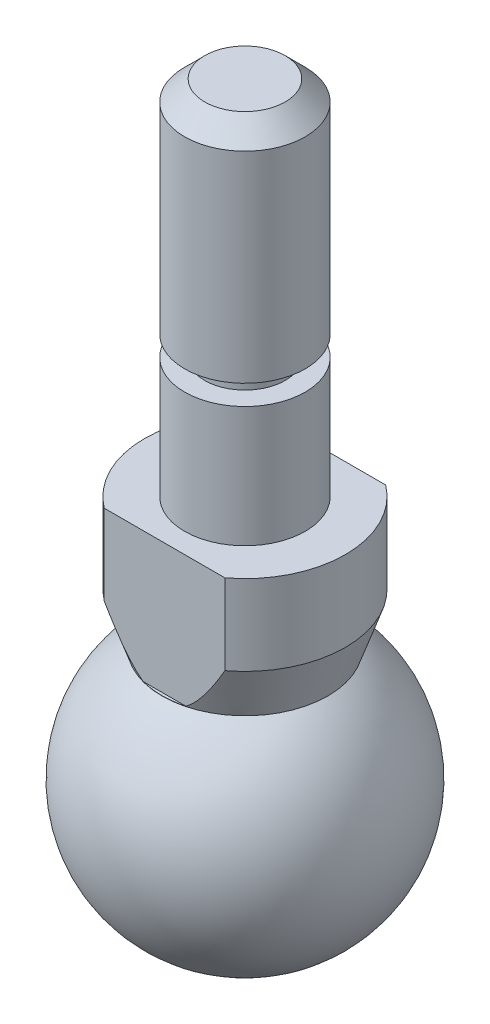
ISO-10303-21;
HEADER;
FILE_DESCRIPTION(('STEP AP214'),'2;1');
FILE_NAME('part.step','',(''),(''),'','','');
FILE_SCHEMA(('AUTOMOTIVE_DESIGN { 1 0 10303 214 1 1 1 1 }'));
ENDSEC;
DATA;
#1=APPLICATION_CONTEXT('core data for automotive mechanical design processes');
#2=APPLICATION_PROTOCOL_DEFINITION('international standard','automotive_design',2000,#1);
#3=PRODUCT_CONTEXT('',#1,'mechanical');
#4=PRODUCT('Part','Part','',(#3));
#5=PRODUCT_RELATED_PRODUCT_CATEGORY('part','',(#4));
#6=PRODUCT_DEFINITION_FORMATION('','',#4);
#7=PRODUCT_DEFINITION_CONTEXT('part definition',#1,'design');
#8=PRODUCT_DEFINITION('design','',#6,#7);
#9=PRODUCT_DEFINITION_SHAPE('','',#8);
#10=(LENGTH_UNIT() NAMED_UNIT(*) SI_UNIT(.MILLI.,.METRE.));
#11=(NAMED_UNIT(*) PLANE_ANGLE_UNIT() SI_UNIT($,.RADIAN.));
#12=(NAMED_UNIT(*) SI_UNIT($,.STERADIAN.) SOLID_ANGLE_UNIT());
#13=UNCERTAINTY_MEASURE_WITH_UNIT(LENGTH_MEASURE(1.E-05),#10,'distance_accuracy_value','');
#14=(GEOMETRIC_REPRESENTATION_CONTEXT(3) GLOBAL_UNCERTAINTY_ASSIGNED_CONTEXT((#13)) GLOBAL_UNIT_ASSIGNED_CONTEXT((#10,
#11,#12)) REPRESENTATION_CONTEXT('',''));
#15=CARTESIAN_POINT('',(0.,0.,0.));
#16=DIRECTION('',(0.,0.,1.));
#17=DIRECTION('',(1.,0.,0.));
#18=AXIS2_PLACEMENT_3D('',#15,#16,#17);
#19=CARTESIAN_POINT('',(0.,30.175,0.));
#20=DIRECTION('',(0.,1.,0.));
#21=DIRECTION('',(0.,0.,1.));
#22=AXIS2_PLACEMENT_3D('',#19,#20,#21);
#23=CYLINDRICAL_SURFACE('',#22,5.);
#24=CARTESIAN_POINT('',(0.,8.175,0.));
#25=DIRECTION('',(0.,1.,0.));
#26=DIRECTION('',(0.,0.,1.));
#27=AXIS2_PLACEMENT_3D('',#24,#25,#26);
#28=CIRCLE('',#27,5.);
#29=CARTESIAN_POINT('',(3.,8.175,4.));
#30=VERTEX_POINT('',#29);
#31=CARTESIAN_POINT('',(3.,8.175,-4.));
#32=VERTEX_POINT('',#31);
#33=EDGE_CURVE('E122',#30,#32,#28,.T.);
#34=ORIENTED_EDGE('',*,*,#33,.T.);
#35=DIRECTION('',(0.,1.,0.));
#36=VECTOR('',#35,1.);
#37=CARTESIAN_POINT('',(3.,30.175,-4.));
#38=LINE('',#37,#36);
#39=CARTESIAN_POINT('',(3.,12.175,-4.));
#40=VERTEX_POINT('',#39);
#41=EDGE_CURVE('E157',#32,#40,#38,.T.);
#42=ORIENTED_EDGE('',*,*,#41,.T.);
#43=CARTESIAN_POINT('',(0.,12.175,0.));
#44=DIRECTION('',(0.,1.,0.));
#45=DIRECTION('',(0.,0.,1.));
#46=AXIS2_PLACEMENT_3D('',#43,#44,#45);
#47=CIRCLE('',#46,5.);
#48=CARTESIAN_POINT('',(3.,12.175,4.));
#49=VERTEX_POINT('',#48);
#50=EDGE_CURVE('E114',#49,#40,#47,.T.);
#51=ORIENTED_EDGE('',*,*,#50,.F.);
#52=DIRECTION('',(0.,1.,0.));
#53=VECTOR('',#52,1.);
#54=CARTESIAN_POINT('',(3.,30.175,4.));
#55=LINE('',#54,#53);
#56=EDGE_CURVE('E64',#49,#30,#55,.F.);
#57=ORIENTED_EDGE('',*,*,#56,.T.);
#58=EDGE_LOOP('',(#34,#42,#51,#57));
#59=FACE_BOUND('',#58,.T.);
#60=ADVANCED_FACE('F40',(#59),#23,.T.);
#61=CARTESIAN_POINT('',(0.,0.,0.));
#62=DIRECTION('',(0.,1.,0.));
#63=DIRECTION('',(1.,0.,0.));
#64=AXIS2_PLACEMENT_3D('',#61,#62,#63);
#65=SPHERICAL_SURFACE('',#64,7.);
#66=CARTESIAN_POINT('',(0.,5.65055793975272,0.));
#67=DIRECTION('',(0.,1.,0.));
#68=DIRECTION('',(0.,0.,1.));
#69=AXIS2_PLACEMENT_3D('',#66,#67,#68);
#70=CIRCLE('',#69,4.13173026340024);
#71=CARTESIAN_POINT('',(0.,5.65055793975272,4.13173026340024));
#72=VERTEX_POINT('',#71);
#73=EDGE_CURVE('E125',#72,#72,#70,.T.);
#74=ORIENTED_EDGE('',*,*,#73,.F.);
#75=EDGE_LOOP('',(#74));
#76=FACE_BOUND('',#75,.T.);
#77=ADVANCED_FACE('F209',(#76),#65,.T.);
#78=CARTESIAN_POINT('',(0.,5.65055793975272,0.));
#79=DIRECTION('',(0.,1.,0.));
#80=DIRECTION('',(0.,0.,1.));
#81=AXIS2_PLACEMENT_3D('',#78,#79,#80);
#82=CONICAL_SURFACE('',#81,4.13173026340024,0.331270640690504);
#83=CARTESIAN_POINT('',(-3.,8.175,-4.));
#84=VERTEX_POINT('',#83);
#85=CARTESIAN_POINT('',(-3.,8.175,4.));
#86=VERTEX_POINT('',#85);
#87=EDGE_CURVE('E109',#84,#86,#28,.T.);
#88=ORIENTED_EDGE('',*,*,#87,.F.);
#89=CARTESIAN_POINT('',(-3.00040125223051,8.1757,-4.));
#90=CARTESIAN_POINT('',(-2.92709025614013,8.04787734366509,-4.));
#91=CARTESIAN_POINT('',(-2.85253885244667,7.9207420998407,-4.));
#92=CARTESIAN_POINT('',(-2.70025129608866,7.668230321007,-4.));
#93=CARTESIAN_POINT('',(-2.62251214400752,7.54285559861608,-4.));
#94=CARTESIAN_POINT('',(-2.46156321835939,7.29181300916988,-4.));
#95=CARTESIAN_POINT('',(-2.37827151976003,7.16619737684099,-4.));
#96=CARTESIAN_POINT('',(-2.2068510719268,6.91835645552338,-4.));
#97=CARTESIAN_POINT('',(-2.11872432522357,6.79612979403244,-4.));
#98=CARTESIAN_POINT('',(-1.9590094929458,6.58619254266003,-4.));
#99=CARTESIAN_POINT('',(-1.88876510038713,6.49746357705535,-4.));
#100=CARTESIAN_POINT('',(-1.74406991104235,6.32351563826822,-4.));
#101=CARTESIAN_POINT('',(-1.66962027976843,6.23829570374424,-4.));
#102=CARTESIAN_POINT('',(-1.51603715612773,6.07311703678136,-4.));
#103=CARTESIAN_POINT('',(-1.43693535013711,5.99312912247618,-4.));
#104=CARTESIAN_POINT('',(-1.27256841860136,5.83982713674373,-4.));
#105=CARTESIAN_POINT('',(-1.187310221692,5.7665057662656,-4.));
#106=CARTESIAN_POINT('',(-1.02025852419477,5.63791180950292,-4.));
#107=CARTESIAN_POINT('',(-0.939333550166531,5.58152850408279,-4.));
#108=CARTESIAN_POINT('',(-0.770953835498196,5.47918477131679,-4.));
#109=CARTESIAN_POINT('',(-0.683497266349091,5.43322727730737,-4.));
#110=CARTESIAN_POINT('',(-0.500707043210453,5.3553381307687,-4.));
#111=CARTESIAN_POINT('',(-0.405272268012618,5.32363503324268,-4.));
#112=CARTESIAN_POINT('',(-0.210007543253151,5.28017539123589,-4.));
#113=CARTESIAN_POINT('',(-0.110190576816242,5.26836353206917,-4.));
#114=CARTESIAN_POINT('',(0.0753490696354366,5.26694285655749,-4.));
#115=CARTESIAN_POINT('',(0.161058475495222,5.27441680191744,-4.));
#116=CARTESIAN_POINT('',(0.329799239823299,5.30444494053993,-4.));
#117=CARTESIAN_POINT('',(0.412827194907424,5.32701756542325,-4.));
#118=CARTESIAN_POINT('',(0.601583831716989,5.3942133416849,-4.));
#119=CARTESIAN_POINT('',(0.705543083091387,5.44370194674514,-4.));
#120=CARTESIAN_POINT('',(0.904712053223092,5.55791292800328,-4.));
#121=CARTESIAN_POINT('',(0.999894839083723,5.62268015944739,-4.));
#122=CARTESIAN_POINT('',(1.2051025877491,5.77968455989777,-4.));
#123=CARTESIAN_POINT('',(1.31292549048604,5.87474664823965,-4.));
#124=CARTESIAN_POINT('',(1.5190862524775,6.07477599780695,-4.));
#125=CARTESIAN_POINT('',(1.61740452074314,6.17976287118333,-4.));
#126=CARTESIAN_POINT('',(1.80723746246576,6.3969428959373,-4.));
#127=CARTESIAN_POINT('',(1.89869973865099,6.5091813149998,-4.));
#128=CARTESIAN_POINT('',(2.07564477785175,6.73807996428054,-4.));
#129=CARTESIAN_POINT('',(2.16113246607184,6.85473642713118,-4.));
#130=CARTESIAN_POINT('',(2.3129895663335,7.07078364417233,-4.));
#131=CARTESIAN_POINT('',(2.38010173061988,7.16965640301758,-4.));
#132=CARTESIAN_POINT('',(2.51165482579349,7.36918733156567,-4.));
#133=CARTESIAN_POINT('',(2.57609522111666,7.4698458535111,-4.));
#134=CARTESIAN_POINT('',(2.70157346413383,7.67076988586631,-4.));
#135=CARTESIAN_POINT('',(2.76265149340876,7.77101040247133,-4.));
#136=CARTESIAN_POINT('',(2.88288623231024,7.97258407650308,-4.));
#137=CARTESIAN_POINT('',(2.94204370177505,8.07391678015668,-4.));
#138=CARTESIAN_POINT('',(3.00040125223051,8.1757,-4.));
#139=B_SPLINE_CURVE_WITH_KNOTS('',3,(#89,#90,#91,#92,#93,#94,#95,#96,#97,#98,#99,#100,#101,#102,
#103,#104,#105,#106,#107,#108,#109,#110,#111,#112,#113,#114,#115,#116,#117,#118,#119,#120,#121,
#122,#123,#124,#125,#126,#127,#128,#129,#130,#131,#132,#133,#134,#135,#136,#137,#138),
.UNSPECIFIED.,.F.,.F.,(4,2,2,2,2,2,2,2,2,2,2,2,2,2,2,2,2,2,2,2,2,2,2,2,4),(0.,0.442085903443447,
0.884597774016387,1.33667410250264,1.78856458770313,2.12796949270043,2.46728078640878,
2.80450139212958,3.14134822083874,3.43667041843167,3.73207560313377,4.03206173194214,
4.33121225626096,4.58784244594604,4.84478648850201,5.18824470397727,5.53272408190323,
5.96294002745509,6.39402462934943,6.82812442615062,7.26186204159843,7.62030931775516,
7.97882810173971,8.33095438808143,8.68293962026138),.UNSPECIFIED.);
#140=CARTESIAN_POINT('',(-1.06805164618176,5.675,-4.));
#141=VERTEX_POINT('',#140);
#142=EDGE_CURVE('E154',#84,#141,#139,.T.);
#143=ORIENTED_EDGE('',*,*,#142,.T.);
#144=CARTESIAN_POINT('',(0.,5.675,0.));
#145=DIRECTION('',(0.,1.,0.));
#146=DIRECTION('',(0.,0.,1.));
#147=AXIS2_PLACEMENT_3D('',#144,#145,#146);
#148=CIRCLE('',#147,4.14013699277108);
#149=CARTESIAN_POINT('',(1.06805164618176,5.675,-4.));
#150=VERTEX_POINT('',#149);
#151=EDGE_CURVE('E11',#150,#141,#148,.T.);
#152=ORIENTED_EDGE('',*,*,#151,.F.);
#153=EDGE_CURVE('E159',#150,#32,#139,.T.);
#154=ORIENTED_EDGE('',*,*,#153,.T.);
#155=ORIENTED_EDGE('',*,*,#33,.F.);
#156=CARTESIAN_POINT('',(3.00040125223051,8.1757,4.));
#157=CARTESIAN_POINT('',(2.92709025614013,8.04787734366509,4.));
#158=CARTESIAN_POINT('',(2.85253885244667,7.9207420998407,4.));
#159=CARTESIAN_POINT('',(2.70025129608866,7.668230321007,4.));
#160=CARTESIAN_POINT('',(2.62251214400752,7.54285559861608,4.));
#161=CARTESIAN_POINT('',(2.46156321835939,7.29181300916988,4.));
#162=CARTESIAN_POINT('',(2.37827151976003,7.16619737684099,4.));
#163=CARTESIAN_POINT('',(2.2068510719268,6.91835645552338,4.));
#164=CARTESIAN_POINT('',(2.11872432522357,6.79612979403244,4.));
#165=CARTESIAN_POINT('',(1.9590094929458,6.58619254266003,4.));
#166=CARTESIAN_POINT('',(1.88876510038713,6.49746357705535,4.));
#167=CARTESIAN_POINT('',(1.74406991104235,6.32351563826822,4.));
#168=CARTESIAN_POINT('',(1.66962027976843,6.23829570374424,4.));
#169=CARTESIAN_POINT('',(1.51603715612773,6.07311703678136,4.));
#170=CARTESIAN_POINT('',(1.43693535013711,5.99312912247618,4.));
#171=CARTESIAN_POINT('',(1.27256841860136,5.83982713674373,4.));
#172=CARTESIAN_POINT('',(1.187310221692,5.7665057662656,4.));
#173=CARTESIAN_POINT('',(1.02025852419477,5.63791180950292,4.));
#174=CARTESIAN_POINT('',(0.939333550166531,5.58152850408279,4.));
#175=CARTESIAN_POINT('',(0.770953835498196,5.47918477131679,4.));
#176=CARTESIAN_POINT('',(0.683497266349091,5.43322727730737,4.));
#177=CARTESIAN_POINT('',(0.500707043210453,5.3553381307687,4.));
#178=CARTESIAN_POINT('',(0.405272268012618,5.32363503324268,4.));
#179=CARTESIAN_POINT('',(0.210007543253151,5.28017539123589,4.));
#180=CARTESIAN_POINT('',(0.110190576816242,5.26836353206917,4.));
#181=CARTESIAN_POINT('',(-0.0753490696354366,5.26694285655749,4.));
#182=CARTESIAN_POINT('',(-0.161058475495222,5.27441680191744,4.));
#183=CARTESIAN_POINT('',(-0.329799239823299,5.30444494053993,4.));
#184=CARTESIAN_POINT('',(-0.412827194907424,5.32701756542325,4.));
#185=CARTESIAN_POINT('',(-0.601583831716989,5.3942133416849,4.));
#186=CARTESIAN_POINT('',(-0.705543083091387,5.44370194674514,4.));
#187=CARTESIAN_POINT('',(-0.904712053223092,5.55791292800328,4.));
#188=CARTESIAN_POINT('',(-0.999894839083723,5.62268015944739,4.));
#189=CARTESIAN_POINT('',(-1.2051025877491,5.77968455989777,4.));
#190=CARTESIAN_POINT('',(-1.31292549048604,5.87474664823965,4.));
#191=CARTESIAN_POINT('',(-1.5190862524775,6.07477599780695,4.));
#192=CARTESIAN_POINT('',(-1.61740452074314,6.17976287118333,4.));
#193=CARTESIAN_POINT('',(-1.80723746246576,6.3969428959373,4.));
#194=CARTESIAN_POINT('',(-1.89869973865099,6.5091813149998,4.));
#195=CARTESIAN_POINT('',(-2.07564477785175,6.73807996428054,4.));
#196=CARTESIAN_POINT('',(-2.16113246607184,6.85473642713118,4.));
#197=CARTESIAN_POINT('',(-2.3129895663335,7.07078364417233,4.));
#198=CARTESIAN_POINT('',(-2.38010173061988,7.16965640301758,4.));
#199=CARTESIAN_POINT('',(-2.51165482579349,7.36918733156567,4.));
#200=CARTESIAN_POINT('',(-2.57609522111666,7.4698458535111,4.));
#201=CARTESIAN_POINT('',(-2.70157346413383,7.67076988586631,4.));
#202=CARTESIAN_POINT('',(-2.76265149340876,7.77101040247133,4.));
#203=CARTESIAN_POINT('',(-2.88288623231024,7.97258407650308,4.));
#204=CARTESIAN_POINT('',(-2.94204370177505,8.07391678015668,4.));
#205=CARTESIAN_POINT('',(-3.00040125223051,8.1757,4.));
#206=B_SPLINE_CURVE_WITH_KNOTS('',3,(#156,#157,#158,#159,#160,#161,#162,#163,#164,#165,#166,
#167,#168,#169,#170,#171,#172,#173,#174,#175,#176,#177,#178,#179,#180,#181,#182,#183,#184,#185,
#186,#187,#188,#189,#190,#191,#192,#193,#194,#195,#196,#197,#198,#199,#200,#201,#202,#203,#204,
#205),.UNSPECIFIED.,.F.,.F.,(4,2,2,2,2,2,2,2,2,2,2,2,2,2,2,2,2,2,2,2,2,2,2,2,4),(0.,
0.442085903443447,0.884597774016387,1.33667410250264,1.78856458770313,2.12796949270043,
2.46728078640878,2.80450139212958,3.14134822083874,3.43667041843167,3.73207560313377,
4.03206173194214,4.33121225626096,4.58784244594604,4.84478648850201,5.18824470397727,
5.53272408190323,5.96294002745509,6.39402462934943,6.82812442615062,7.26186204159843,
7.62030931775516,7.97882810173971,8.33095438808143,8.68293962026138),.UNSPECIFIED.);
#207=CARTESIAN_POINT('',(1.06805164618176,5.675,4.));
#208=VERTEX_POINT('',#207);
#209=EDGE_CURVE('E111',#30,#208,#206,.T.);
#210=ORIENTED_EDGE('',*,*,#209,.T.);
#211=CARTESIAN_POINT('',(0.,5.675,0.));
#212=DIRECTION('',(0.,1.,0.));
#213=DIRECTION('',(0.,0.,1.));
#214=AXIS2_PLACEMENT_3D('',#211,#212,#213);
#215=CIRCLE('',#214,4.14013699277108);
#216=CARTESIAN_POINT('',(-1.06805164618176,5.675,4.));
#217=VERTEX_POINT('',#216);
#218=EDGE_CURVE('E49',#217,#208,#215,.T.);
#219=ORIENTED_EDGE('',*,*,#218,.F.);
#220=EDGE_CURVE('E110',#217,#86,#206,.T.);
#221=ORIENTED_EDGE('',*,*,#220,.T.);
#222=EDGE_LOOP('',(#88,#143,#152,#154,#155,#210,#219,#221));
#223=FACE_BOUND('',#222,.T.);
#224=ORIENTED_EDGE('',*,*,#73,.T.);
#225=EDGE_LOOP('',(#224));
#226=FACE_BOUND('',#225,.T.);
#227=ADVANCED_FACE('F143',(#223,#226),#82,.T.);
#228=CARTESIAN_POINT('',(-3.,12.175,-4.));
#229=VERTEX_POINT('',#228);
#230=CARTESIAN_POINT('',(-3.,12.175,4.));
#231=VERTEX_POINT('',#230);
#232=EDGE_CURVE('E107',#229,#231,#47,.T.);
#233=ORIENTED_EDGE('',*,*,#232,.F.);
#234=DIRECTION('',(0.,1.,0.));
#235=VECTOR('',#234,1.);
#236=CARTESIAN_POINT('',(-3.,30.175,-4.));
#237=LINE('',#236,#235);
#238=EDGE_CURVE('E56',#229,#84,#237,.F.);
#239=ORIENTED_EDGE('',*,*,#238,.T.);
#240=ORIENTED_EDGE('',*,*,#87,.T.);
#241=DIRECTION('',(0.,1.,0.));
#242=VECTOR('',#241,1.);
#243=CARTESIAN_POINT('',(-3.,30.175,4.));
#244=LINE('',#243,#242);
#245=EDGE_CURVE('E94',#86,#231,#244,.T.);
#246=ORIENTED_EDGE('',*,*,#245,.T.);
#247=EDGE_LOOP('',(#233,#239,#240,#246));
#248=FACE_BOUND('',#247,.T.);
#249=ADVANCED_FACE('F106',(#248),#23,.T.);
#250=CARTESIAN_POINT('',(5.,12.175,0.));
#251=DIRECTION('',(0.,-1.,0.));
#252=DIRECTION('',(0.,0.,-1.));
#253=AXIS2_PLACEMENT_3D('',#250,#251,#252);
#254=PLANE('',#253);
#255=CARTESIAN_POINT('',(0.,12.175,0.));
#256=DIRECTION('',(0.,1.,0.));
#257=DIRECTION('',(0.,0.,1.));
#258=AXIS2_PLACEMENT_3D('',#255,#256,#257);
#259=CIRCLE('',#258,3.);
#260=CARTESIAN_POINT('',(0.,12.175,3.));
#261=VERTEX_POINT('',#260);
#262=EDGE_CURVE('E115',#261,#261,#259,.T.);
#263=ORIENTED_EDGE('',*,*,#262,.F.);
#264=EDGE_LOOP('',(#263));
#265=FACE_BOUND('',#264,.T.);
#266=ORIENTED_EDGE('',*,*,#50,.T.);
#267=DIRECTION('',(-1.,0.,0.));
#268=VECTOR('',#267,1.);
#269=CARTESIAN_POINT('',(5.,12.175,-4.));
#270=LINE('',#269,#268);
#271=EDGE_CURVE('E100',#40,#229,#270,.T.);
#272=ORIENTED_EDGE('',*,*,#271,.T.);
#273=ORIENTED_EDGE('',*,*,#232,.T.);
#274=DIRECTION('',(1.,0.,0.));
#275=VECTOR('',#274,1.);
#276=CARTESIAN_POINT('',(5.,12.175,4.));
#277=LINE('',#276,#275);
#278=EDGE_CURVE('E90',#231,#49,#277,.T.);
#279=ORIENTED_EDGE('',*,*,#278,.T.);
#280=EDGE_LOOP('',(#266,#272,#273,#279));
#281=FACE_BOUND('',#280,.T.);
#282=ADVANCED_FACE('F113',(#265,#281),#254,.F.);
#283=CARTESIAN_POINT('',(0.,30.175,0.));
#284=DIRECTION('',(0.,1.,0.));
#285=DIRECTION('',(0.,0.,1.));
#286=AXIS2_PLACEMENT_3D('',#283,#284,#285);
#287=CYLINDRICAL_SURFACE('',#286,3.);
#288=CARTESIAN_POINT('',(0.,18.175,0.));
#289=DIRECTION('',(0.,1.,0.));
#290=DIRECTION('',(0.,0.,1.));
#291=AXIS2_PLACEMENT_3D('',#288,#289,#290);
#292=CIRCLE('',#291,3.);
#293=CARTESIAN_POINT('',(0.,18.175,3.));
#294=VERTEX_POINT('',#293);
#295=EDGE_CURVE('E118',#294,#294,#292,.T.);
#296=ORIENTED_EDGE('',*,*,#295,.F.);
#297=EDGE_LOOP('',(#296));
#298=FACE_BOUND('',#297,.T.);
#299=ORIENTED_EDGE('',*,*,#262,.T.);
#300=EDGE_LOOP('',(#299));
#301=FACE_BOUND('',#300,.T.);
#302=ADVANCED_FACE('F198',(#298,#301),#287,.T.);
#303=CARTESIAN_POINT('',(3.,18.175,0.));
#304=DIRECTION('',(0.,-1.,0.));
#305=DIRECTION('',(0.,0.,-1.));
#306=AXIS2_PLACEMENT_3D('',#303,#304,#305);
#307=PLANE('',#306);
#308=CARTESIAN_POINT('',(0.,18.175,0.));
#309=DIRECTION('',(0.,1.,0.));
#310=DIRECTION('',(0.,0.,1.));
#311=AXIS2_PLACEMENT_3D('',#308,#309,#310);
#312=CIRCLE('',#311,2.);
#313=CARTESIAN_POINT('',(0.,18.175,2.));
#314=VERTEX_POINT('',#313);
#315=EDGE_CURVE('E224',#314,#314,#312,.T.);
#316=ORIENTED_EDGE('',*,*,#315,.F.);
#317=EDGE_LOOP('',(#316));
#318=FACE_BOUND('',#317,.T.);
#319=ORIENTED_EDGE('',*,*,#295,.T.);
#320=EDGE_LOOP('',(#319));
#321=FACE_BOUND('',#320,.T.);
#322=ADVANCED_FACE('F194',(#318,#321),#307,.F.);
#323=CARTESIAN_POINT('',(0.,30.175,0.));
#324=DIRECTION('',(0.,1.,0.));
#325=DIRECTION('',(0.,0.,1.));
#326=AXIS2_PLACEMENT_3D('',#323,#324,#325);
#327=CYLINDRICAL_SURFACE('',#326,2.);
#328=CARTESIAN_POINT('',(0.,19.175,0.));
#329=DIRECTION('',(0.,1.,0.));
#330=DIRECTION('',(0.,0.,1.));
#331=AXIS2_PLACEMENT_3D('',#328,#329,#330);
#332=CIRCLE('',#331,2.);
#333=CARTESIAN_POINT('',(0.,19.175,2.));
#334=VERTEX_POINT('',#333);
#335=EDGE_CURVE('E220',#334,#334,#332,.T.);
#336=ORIENTED_EDGE('',*,*,#335,.F.);
#337=EDGE_LOOP('',(#336));
#338=FACE_BOUND('',#337,.T.);
#339=ORIENTED_EDGE('',*,*,#315,.T.);
#340=EDGE_LOOP('',(#339));
#341=FACE_BOUND('',#340,.T.);
#342=ADVANCED_FACE('F190',(#338,#341),#327,.T.);
#343=CARTESIAN_POINT('',(2.,19.175,0.));
#344=DIRECTION('',(0.,1.,0.));
#345=DIRECTION('',(0.,0.,1.));
#346=AXIS2_PLACEMENT_3D('',#343,#344,#345);
#347=PLANE('',#346);
#348=CARTESIAN_POINT('',(0.,19.175,0.));
#349=DIRECTION('',(0.,1.,0.));
#350=DIRECTION('',(0.,0.,1.));
#351=AXIS2_PLACEMENT_3D('',#348,#349,#350);
#352=CIRCLE('',#351,3.);
#353=CARTESIAN_POINT('',(0.,19.175,3.));
#354=VERTEX_POINT('',#353);
#355=EDGE_CURVE('E217',#354,#354,#352,.T.);
#356=ORIENTED_EDGE('',*,*,#355,.F.);
#357=EDGE_LOOP('',(#356));
#358=FACE_BOUND('',#357,.T.);
#359=ORIENTED_EDGE('',*,*,#335,.T.);
#360=EDGE_LOOP('',(#359));
#361=FACE_BOUND('',#360,.T.);
#362=ADVANCED_FACE('F186',(#358,#361),#347,.F.);
#363=CARTESIAN_POINT('',(0.,30.175,0.));
#364=DIRECTION('',(0.,1.,0.));
#365=DIRECTION('',(0.,0.,1.));
#366=AXIS2_PLACEMENT_3D('',#363,#364,#365);
#367=CYLINDRICAL_SURFACE('',#366,3.);
#368=CARTESIAN_POINT('',(0.,29.175,0.));
#369=DIRECTION('',(0.,-1.,0.));
#370=DIRECTION('',(0.,0.,-1.));
#371=AXIS2_PLACEMENT_3D('',#368,#369,#370);
#372=CIRCLE('',#371,3.);
#373=CARTESIAN_POINT('',(0.,29.175,-3.));
#374=VERTEX_POINT('',#373);
#375=EDGE_CURVE('E101',#374,#374,#372,.T.);
#376=ORIENTED_EDGE('',*,*,#375,.T.);
#377=EDGE_LOOP('',(#376));
#378=FACE_BOUND('',#377,.T.);
#379=ORIENTED_EDGE('',*,*,#355,.T.);
#380=EDGE_LOOP('',(#379));
#381=FACE_BOUND('',#380,.T.);
#382=ADVANCED_FACE('F182',(#378,#381),#367,.T.);
#383=CARTESIAN_POINT('',(3.,30.175,0.));
#384=DIRECTION('',(0.,-1.,0.));
#385=DIRECTION('',(0.,0.,-1.));
#386=AXIS2_PLACEMENT_3D('',#383,#384,#385);
#387=PLANE('',#386);
#388=CARTESIAN_POINT('',(0.,30.175,0.));
#389=DIRECTION('',(0.,-1.,0.));
#390=DIRECTION('',(0.,0.,-1.));
#391=AXIS2_PLACEMENT_3D('',#388,#389,#390);
#392=CIRCLE('',#391,2.00000000000001);
#393=CARTESIAN_POINT('',(0.,30.175,-2.00000000000001));
#394=VERTEX_POINT('',#393);
#395=EDGE_CURVE('E128',#394,#394,#392,.F.);
#396=ORIENTED_EDGE('',*,*,#395,.T.);
#397=EDGE_LOOP('',(#396));
#398=FACE_BOUND('',#397,.T.);
#399=ADVANCED_FACE('F179',(#398),#387,.F.);
#400=CARTESIAN_POINT('',(0.,30.175,0.));
#401=DIRECTION('',(0.,-1.,0.));
#402=DIRECTION('',(0.,0.,-1.));
#403=AXIS2_PLACEMENT_3D('',#400,#401,#402);
#404=CONICAL_SURFACE('',#403,2.00000000000001,0.785398163397444);
#405=ORIENTED_EDGE('',*,*,#375,.F.);
#406=EDGE_LOOP('',(#405));
#407=FACE_BOUND('',#406,.T.);
#408=ORIENTED_EDGE('',*,*,#395,.F.);
#409=EDGE_LOOP('',(#408));
#410=FACE_BOUND('',#409,.T.);
#411=ADVANCED_FACE('F43',(#407,#410),#404,.T.);
#412=CARTESIAN_POINT('',(0.,5.675,0.));
#413=DIRECTION('',(0.,1.,0.));
#414=DIRECTION('',(0.,0.,1.));
#415=AXIS2_PLACEMENT_3D('',#412,#413,#414);
#416=PLANE('',#415);
#417=ORIENTED_EDGE('',*,*,#218,.T.);
#418=DIRECTION('',(-1.,0.,0.));
#419=VECTOR('',#418,1.);
#420=CARTESIAN_POINT('',(-5.42690543216312,5.675,4.));
#421=LINE('',#420,#419);
#422=EDGE_CURVE('E137',#208,#217,#421,.T.);
#423=ORIENTED_EDGE('',*,*,#422,.T.);
#424=EDGE_LOOP('',(#417,#423));
#425=FACE_BOUND('',#424,.T.);
#426=ADVANCED_FACE('F136',(#425),#416,.T.);
#427=CARTESIAN_POINT('',(-5.42690543216312,5.675,4.));
#428=DIRECTION('',(0.,0.,-1.));
#429=DIRECTION('',(-1.,0.,0.));
#430=AXIS2_PLACEMENT_3D('',#427,#428,#429);
#431=PLANE('',#430);
#432=ORIENTED_EDGE('',*,*,#422,.F.);
#433=ORIENTED_EDGE('',*,*,#209,.F.);
#434=ORIENTED_EDGE('',*,*,#56,.F.);
#435=ORIENTED_EDGE('',*,*,#278,.F.);
#436=ORIENTED_EDGE('',*,*,#245,.F.);
#437=ORIENTED_EDGE('',*,*,#220,.F.);
#438=EDGE_LOOP('',(#432,#433,#434,#435,#436,#437));
#439=FACE_BOUND('',#438,.T.);
#440=ADVANCED_FACE('F93',(#439),#431,.F.);
#441=CARTESIAN_POINT('',(0.,5.675,0.));
#442=DIRECTION('',(0.,1.,0.));
#443=DIRECTION('',(0.,0.,1.));
#444=AXIS2_PLACEMENT_3D('',#441,#442,#443);
#445=PLANE('',#444);
#446=ORIENTED_EDGE('',*,*,#151,.T.);
#447=DIRECTION('',(1.,0.,0.));
#448=VECTOR('',#447,1.);
#449=CARTESIAN_POINT('',(-5.42690543216312,5.675,-4.));
#450=LINE('',#449,#448);
#451=EDGE_CURVE('E140',#141,#150,#450,.T.);
#452=ORIENTED_EDGE('',*,*,#451,.T.);
#453=EDGE_LOOP('',(#446,#452));
#454=FACE_BOUND('',#453,.T.);
#455=ADVANCED_FACE('F174',(#454),#445,.T.);
#456=CARTESIAN_POINT('',(-5.42690543216312,5.675,-4.));
#457=DIRECTION('',(0.,0.,1.));
#458=DIRECTION('',(1.,0.,0.));
#459=AXIS2_PLACEMENT_3D('',#456,#457,#458);
#460=PLANE('',#459);
#461=ORIENTED_EDGE('',*,*,#451,.F.);
#462=ORIENTED_EDGE('',*,*,#142,.F.);
#463=ORIENTED_EDGE('',*,*,#238,.F.);
#464=ORIENTED_EDGE('',*,*,#271,.F.);
#465=ORIENTED_EDGE('',*,*,#41,.F.);
#466=ORIENTED_EDGE('',*,*,#153,.F.);
#467=EDGE_LOOP('',(#461,#462,#463,#464,#465,#466));
#468=FACE_BOUND('',#467,.T.);
#469=ADVANCED_FACE('F169',(#468),#460,.F.);
#470=CLOSED_SHELL('',(#60,#77,#227,#249,#282,#302,#322,#342,#362,#382,#399,#411,#426,#440,#455,#469));
#471=MANIFOLD_SOLID_BREP('B2',#470);
#472=ADVANCED_BREP_SHAPE_REPRESENTATION('',(#18,#471),#14);
#473=SHAPE_DEFINITION_REPRESENTATION(#9,#472);
ENDSEC;
END-ISO-10303-21;
